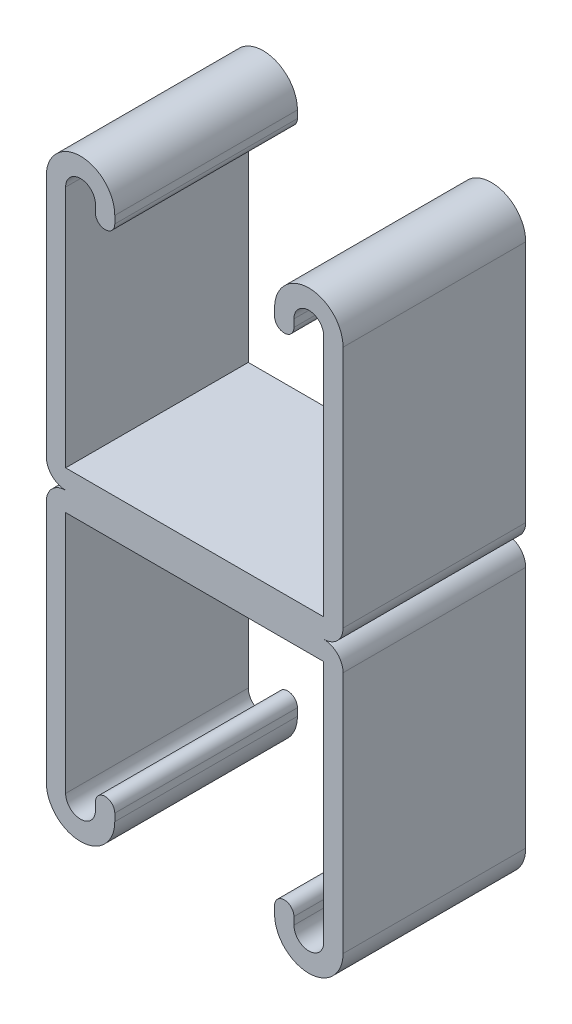
ISO-10303-21;
HEADER;
FILE_DESCRIPTION(('STEP AP214'),'2;1');
FILE_NAME('part.step','',(''),(''),'','','');
FILE_SCHEMA(('AUTOMOTIVE_DESIGN { 1 0 10303 214 1 1 1 1 }'));
ENDSEC;
DATA;
#1=APPLICATION_CONTEXT('core data for automotive mechanical design processes');
#2=APPLICATION_PROTOCOL_DEFINITION('international standard','automotive_design',2000,#1);
#3=PRODUCT_CONTEXT('',#1,'mechanical');
#4=PRODUCT('Part','Part','',(#3));
#5=PRODUCT_RELATED_PRODUCT_CATEGORY('part','',(#4));
#6=PRODUCT_DEFINITION_FORMATION('','',#4);
#7=PRODUCT_DEFINITION_CONTEXT('part definition',#1,'design');
#8=PRODUCT_DEFINITION('design','',#6,#7);
#9=PRODUCT_DEFINITION_SHAPE('','',#8);
#10=(LENGTH_UNIT() NAMED_UNIT(*) SI_UNIT(.MILLI.,.METRE.));
#11=(NAMED_UNIT(*) PLANE_ANGLE_UNIT() SI_UNIT($,.RADIAN.));
#12=(NAMED_UNIT(*) SI_UNIT($,.STERADIAN.) SOLID_ANGLE_UNIT());
#13=UNCERTAINTY_MEASURE_WITH_UNIT(LENGTH_MEASURE(1.E-05),#10,'distance_accuracy_value','');
#14=(GEOMETRIC_REPRESENTATION_CONTEXT(3) GLOBAL_UNCERTAINTY_ASSIGNED_CONTEXT((#13)) GLOBAL_UNIT_ASSIGNED_CONTEXT((#10,
#11,#12)) REPRESENTATION_CONTEXT('',''));
#15=CARTESIAN_POINT('',(0.,0.,0.));
#16=DIRECTION('',(0.,0.,1.));
#17=DIRECTION('',(1.,0.,0.));
#18=AXIS2_PLACEMENT_3D('',#15,#16,#17);
#19=CARTESIAN_POINT('',(-15.875,36.5125,12.7));
#20=DIRECTION('',(0.,0.,-1.));
#21=DIRECTION('',(-1.,0.,0.));
#22=AXIS2_PLACEMENT_3D('',#19,#20,#21);
#23=CYLINDRICAL_SURFACE('',#22,4.7625);
#24=CARTESIAN_POINT('',(-15.875,36.5125,-12.7));
#25=DIRECTION('',(0.,0.,1.));
#26=DIRECTION('',(-1.,0.,0.));
#27=AXIS2_PLACEMENT_3D('',#24,#25,#26);
#28=CIRCLE('',#27,4.7625);
#29=CARTESIAN_POINT('',(-11.1125,36.5125,-12.7));
#30=VERTEX_POINT('',#29);
#31=CARTESIAN_POINT('',(-20.6375,36.5125,-12.7));
#32=VERTEX_POINT('',#31);
#33=EDGE_CURVE('E189',#30,#32,#28,.T.);
#34=ORIENTED_EDGE('',*,*,#33,.T.);
#35=DIRECTION('',(0.,0.,-1.));
#36=VECTOR('',#35,1.);
#37=CARTESIAN_POINT('',(-20.6375,36.5125,12.7));
#38=LINE('',#37,#36);
#39=CARTESIAN_POINT('',(-20.6375,36.5125,12.7));
#40=VERTEX_POINT('',#39);
#41=EDGE_CURVE('E11',#40,#32,#38,.T.);
#42=ORIENTED_EDGE('',*,*,#41,.F.);
#43=CARTESIAN_POINT('',(-15.875,36.5125,12.7));
#44=DIRECTION('',(0.,0.,1.));
#45=DIRECTION('',(-1.,0.,0.));
#46=AXIS2_PLACEMENT_3D('',#43,#44,#45);
#47=CIRCLE('',#46,4.7625);
#48=CARTESIAN_POINT('',(-11.1125,36.5125,12.7));
#49=VERTEX_POINT('',#48);
#50=EDGE_CURVE('E222',#49,#40,#47,.T.);
#51=ORIENTED_EDGE('',*,*,#50,.F.);
#52=DIRECTION('',(0.,0.,-1.));
#53=VECTOR('',#52,1.);
#54=CARTESIAN_POINT('',(-11.1125,36.5125,12.7));
#55=LINE('',#54,#53);
#56=EDGE_CURVE('E185',#49,#30,#55,.T.);
#57=ORIENTED_EDGE('',*,*,#56,.T.);
#58=EDGE_LOOP('',(#34,#42,#51,#57));
#59=FACE_BOUND('',#58,.T.);
#60=ADVANCED_FACE('F32',(#59),#23,.T.);
#61=CARTESIAN_POINT('',(-20.6375,36.5125,12.7));
#62=DIRECTION('',(1.,0.,0.));
#63=DIRECTION('',(0.,1.,0.));
#64=AXIS2_PLACEMENT_3D('',#61,#62,#63);
#65=PLANE('',#64);
#66=DIRECTION('',(0.,-1.,0.));
#67=VECTOR('',#66,1.);
#68=CARTESIAN_POINT('',(-20.6375,36.5125,-12.7));
#69=LINE('',#68,#67);
#70=CARTESIAN_POINT('',(-20.6375,2.6924,-12.7));
#71=VERTEX_POINT('',#70);
#72=EDGE_CURVE('E192',#32,#71,#69,.T.);
#73=ORIENTED_EDGE('',*,*,#72,.T.);
#74=DIRECTION('',(0.,0.,-1.));
#75=VECTOR('',#74,1.);
#76=CARTESIAN_POINT('',(-20.6375,2.6924,12.7));
#77=LINE('',#76,#75);
#78=CARTESIAN_POINT('',(-20.6375,2.6924,12.7));
#79=VERTEX_POINT('',#78);
#80=EDGE_CURVE('E40',#79,#71,#77,.T.);
#81=ORIENTED_EDGE('',*,*,#80,.F.);
#82=DIRECTION('',(0.,-1.,0.));
#83=VECTOR('',#82,1.);
#84=CARTESIAN_POINT('',(-20.6375,36.5125,12.7));
#85=LINE('',#84,#83);
#86=EDGE_CURVE('E119',#40,#79,#85,.T.);
#87=ORIENTED_EDGE('',*,*,#86,.F.);
#88=ORIENTED_EDGE('',*,*,#41,.T.);
#89=EDGE_LOOP('',(#73,#81,#87,#88));
#90=FACE_BOUND('',#89,.T.);
#91=ADVANCED_FACE('F384',(#90),#65,.F.);
#92=CARTESIAN_POINT('',(-17.9451,2.6924,12.7));
#93=DIRECTION('',(0.,0.,-1.));
#94=DIRECTION('',(-1.,0.,0.));
#95=AXIS2_PLACEMENT_3D('',#92,#93,#94);
#96=CYLINDRICAL_SURFACE('',#95,2.6924);
#97=CARTESIAN_POINT('',(-17.9451,2.6924,-12.7));
#98=DIRECTION('',(0.,0.,1.));
#99=DIRECTION('',(-1.,0.,0.));
#100=AXIS2_PLACEMENT_3D('',#97,#98,#99);
#101=CIRCLE('',#100,2.6924);
#102=CARTESIAN_POINT('',(-17.9451,0.,-12.7));
#103=VERTEX_POINT('',#102);
#104=EDGE_CURVE('E195',#71,#103,#101,.T.);
#105=ORIENTED_EDGE('',*,*,#104,.T.);
#106=DIRECTION('',(0.,0.,-1.));
#107=VECTOR('',#106,1.);
#108=CARTESIAN_POINT('',(-17.9451,0.,12.7));
#109=LINE('',#108,#107);
#110=CARTESIAN_POINT('',(-17.9451,0.,12.7));
#111=VERTEX_POINT('',#110);
#112=EDGE_CURVE('E259',#111,#103,#109,.T.);
#113=ORIENTED_EDGE('',*,*,#112,.F.);
#114=CARTESIAN_POINT('',(-17.9451,2.6924,12.7));
#115=DIRECTION('',(0.,0.,1.));
#116=DIRECTION('',(-1.,0.,0.));
#117=AXIS2_PLACEMENT_3D('',#114,#115,#116);
#118=CIRCLE('',#117,2.6924);
#119=EDGE_CURVE('E267',#79,#111,#118,.T.);
#120=ORIENTED_EDGE('',*,*,#119,.F.);
#121=ORIENTED_EDGE('',*,*,#80,.T.);
#122=EDGE_LOOP('',(#105,#113,#120,#121));
#123=FACE_BOUND('',#122,.T.);
#124=ADVANCED_FACE('F265',(#123),#96,.T.);
#125=CARTESIAN_POINT('',(17.9451,2.6924,12.7));
#126=DIRECTION('',(0.,0.,-1.));
#127=DIRECTION('',(-1.,0.,0.));
#128=AXIS2_PLACEMENT_3D('',#125,#126,#127);
#129=CYLINDRICAL_SURFACE('',#128,2.6924);
#130=CARTESIAN_POINT('',(17.9451,2.6924,-12.7));
#131=DIRECTION('',(0.,0.,1.));
#132=DIRECTION('',(1.,0.,0.));
#133=AXIS2_PLACEMENT_3D('',#130,#131,#132);
#134=CIRCLE('',#133,2.6924);
#135=CARTESIAN_POINT('',(17.9451,0.,-12.7));
#136=VERTEX_POINT('',#135);
#137=CARTESIAN_POINT('',(20.6375,2.6924,-12.7));
#138=VERTEX_POINT('',#137);
#139=EDGE_CURVE('E197',#136,#138,#134,.T.);
#140=ORIENTED_EDGE('',*,*,#139,.T.);
#141=DIRECTION('',(0.,0.,-1.));
#142=VECTOR('',#141,1.);
#143=CARTESIAN_POINT('',(20.6375,2.6924,12.7));
#144=LINE('',#143,#142);
#145=CARTESIAN_POINT('',(20.6375,2.6924,12.7));
#146=VERTEX_POINT('',#145);
#147=EDGE_CURVE('E253',#146,#138,#144,.T.);
#148=ORIENTED_EDGE('',*,*,#147,.F.);
#149=CARTESIAN_POINT('',(17.9451,2.6924,12.7));
#150=DIRECTION('',(0.,0.,1.));
#151=DIRECTION('',(1.,0.,0.));
#152=AXIS2_PLACEMENT_3D('',#149,#150,#151);
#153=CIRCLE('',#152,2.6924);
#154=CARTESIAN_POINT('',(17.9451,0.,12.7));
#155=VERTEX_POINT('',#154);
#156=EDGE_CURVE('E341',#155,#146,#153,.T.);
#157=ORIENTED_EDGE('',*,*,#156,.F.);
#158=DIRECTION('',(0.,0.,-1.));
#159=VECTOR('',#158,1.);
#160=CARTESIAN_POINT('',(17.9451,0.,12.7));
#161=LINE('',#160,#159);
#162=EDGE_CURVE('E256',#155,#136,#161,.T.);
#163=ORIENTED_EDGE('',*,*,#162,.T.);
#164=EDGE_LOOP('',(#140,#148,#157,#163));
#165=FACE_BOUND('',#164,.T.);
#166=ADVANCED_FACE('F391',(#165),#129,.T.);
#167=CARTESIAN_POINT('',(20.6375,2.6924,12.7));
#168=DIRECTION('',(-1.,0.,0.));
#169=DIRECTION('',(0.,0.,1.));
#170=AXIS2_PLACEMENT_3D('',#167,#168,#169);
#171=PLANE('',#170);
#172=DIRECTION('',(0.,1.,0.));
#173=VECTOR('',#172,1.);
#174=CARTESIAN_POINT('',(20.6375,2.6924,-12.7));
#175=LINE('',#174,#173);
#176=CARTESIAN_POINT('',(20.6375,36.5125,-12.7));
#177=VERTEX_POINT('',#176);
#178=EDGE_CURVE('E199',#138,#177,#175,.T.);
#179=ORIENTED_EDGE('',*,*,#178,.T.);
#180=DIRECTION('',(0.,0.,-1.));
#181=VECTOR('',#180,1.);
#182=CARTESIAN_POINT('',(20.6375,36.5125,12.7));
#183=LINE('',#182,#181);
#184=CARTESIAN_POINT('',(20.6375,36.5125,12.7));
#185=VERTEX_POINT('',#184);
#186=EDGE_CURVE('E250',#185,#177,#183,.T.);
#187=ORIENTED_EDGE('',*,*,#186,.F.);
#188=DIRECTION('',(0.,1.,0.));
#189=VECTOR('',#188,1.);
#190=CARTESIAN_POINT('',(20.6375,2.6924,12.7));
#191=LINE('',#190,#189);
#192=EDGE_CURVE('E343',#146,#185,#191,.T.);
#193=ORIENTED_EDGE('',*,*,#192,.F.);
#194=ORIENTED_EDGE('',*,*,#147,.T.);
#195=EDGE_LOOP('',(#179,#187,#193,#194));
#196=FACE_BOUND('',#195,.T.);
#197=ADVANCED_FACE('F396',(#196),#171,.F.);
#198=CARTESIAN_POINT('',(15.875,36.5125,12.7));
#199=DIRECTION('',(0.,0.,-1.));
#200=DIRECTION('',(-1.,0.,0.));
#201=AXIS2_PLACEMENT_3D('',#198,#199,#200);
#202=CYLINDRICAL_SURFACE('',#201,4.7625);
#203=CARTESIAN_POINT('',(15.875,36.5125,-12.7));
#204=DIRECTION('',(0.,0.,1.));
#205=DIRECTION('',(1.,0.,0.));
#206=AXIS2_PLACEMENT_3D('',#203,#204,#205);
#207=CIRCLE('',#206,4.7625);
#208=CARTESIAN_POINT('',(11.1125,36.5125,-12.7));
#209=VERTEX_POINT('',#208);
#210=EDGE_CURVE('E201',#177,#209,#207,.T.);
#211=ORIENTED_EDGE('',*,*,#210,.T.);
#212=DIRECTION('',(0.,0.,-1.));
#213=VECTOR('',#212,1.);
#214=CARTESIAN_POINT('',(11.1125,36.5125,12.7));
#215=LINE('',#214,#213);
#216=CARTESIAN_POINT('',(11.1125,36.5125,12.7));
#217=VERTEX_POINT('',#216);
#218=EDGE_CURVE('E247',#217,#209,#215,.T.);
#219=ORIENTED_EDGE('',*,*,#218,.F.);
#220=CARTESIAN_POINT('',(15.875,36.5125,12.7));
#221=DIRECTION('',(0.,0.,1.));
#222=DIRECTION('',(1.,0.,0.));
#223=AXIS2_PLACEMENT_3D('',#220,#221,#222);
#224=CIRCLE('',#223,4.7625);
#225=EDGE_CURVE('E345',#185,#217,#224,.T.);
#226=ORIENTED_EDGE('',*,*,#225,.F.);
#227=ORIENTED_EDGE('',*,*,#186,.T.);
#228=EDGE_LOOP('',(#211,#219,#226,#227));
#229=FACE_BOUND('',#228,.T.);
#230=ADVANCED_FACE('F400',(#229),#202,.T.);
#231=CARTESIAN_POINT('',(11.1125,36.5125,12.7));
#232=DIRECTION('',(1.,0.,0.));
#233=DIRECTION('',(0.,1.,0.));
#234=AXIS2_PLACEMENT_3D('',#231,#232,#233);
#235=PLANE('',#234);
#236=DIRECTION('',(0.,-1.,0.));
#237=VECTOR('',#236,1.);
#238=CARTESIAN_POINT('',(11.1125,36.5125,-12.7));
#239=LINE('',#238,#237);
#240=CARTESIAN_POINT('',(11.1125,35.47745,-12.7));
#241=VERTEX_POINT('',#240);
#242=EDGE_CURVE('E203',#209,#241,#239,.T.);
#243=ORIENTED_EDGE('',*,*,#242,.T.);
#244=DIRECTION('',(0.,0.,-1.));
#245=VECTOR('',#244,1.);
#246=CARTESIAN_POINT('',(11.1125,35.47745,12.7));
#247=LINE('',#246,#245);
#248=CARTESIAN_POINT('',(11.1125,35.47745,12.7));
#249=VERTEX_POINT('',#248);
#250=EDGE_CURVE('E244',#249,#241,#247,.T.);
#251=ORIENTED_EDGE('',*,*,#250,.F.);
#252=DIRECTION('',(0.,-1.,0.));
#253=VECTOR('',#252,1.);
#254=CARTESIAN_POINT('',(11.1125,36.5125,12.7));
#255=LINE('',#254,#253);
#256=EDGE_CURVE('E347',#217,#249,#255,.T.);
#257=ORIENTED_EDGE('',*,*,#256,.F.);
#258=ORIENTED_EDGE('',*,*,#218,.T.);
#259=EDGE_LOOP('',(#243,#251,#257,#258));
#260=FACE_BOUND('',#259,.T.);
#261=ADVANCED_FACE('F404',(#260),#235,.F.);
#262=CARTESIAN_POINT('',(12.4587,35.47745,12.7));
#263=DIRECTION('',(0.,0.,-1.));
#264=DIRECTION('',(-1.,0.,0.));
#265=AXIS2_PLACEMENT_3D('',#262,#263,#264);
#266=CYLINDRICAL_SURFACE('',#265,1.3462);
#267=CARTESIAN_POINT('',(12.4587,35.47745,-12.7));
#268=DIRECTION('',(0.,0.,1.));
#269=DIRECTION('',(1.,0.,0.));
#270=AXIS2_PLACEMENT_3D('',#267,#268,#269);
#271=CIRCLE('',#270,1.3462);
#272=CARTESIAN_POINT('',(13.8049,35.47745,-12.7));
#273=VERTEX_POINT('',#272);
#274=EDGE_CURVE('E205',#241,#273,#271,.T.);
#275=ORIENTED_EDGE('',*,*,#274,.T.);
#276=DIRECTION('',(0.,0.,-1.));
#277=VECTOR('',#276,1.);
#278=CARTESIAN_POINT('',(13.8049,35.47745,12.7));
#279=LINE('',#278,#277);
#280=CARTESIAN_POINT('',(13.8049,35.47745,12.7));
#281=VERTEX_POINT('',#280);
#282=EDGE_CURVE('E241',#281,#273,#279,.T.);
#283=ORIENTED_EDGE('',*,*,#282,.F.);
#284=CARTESIAN_POINT('',(12.4587,35.47745,12.7));
#285=DIRECTION('',(0.,0.,1.));
#286=DIRECTION('',(1.,0.,0.));
#287=AXIS2_PLACEMENT_3D('',#284,#285,#286);
#288=CIRCLE('',#287,1.3462);
#289=EDGE_CURVE('E349',#249,#281,#288,.T.);
#290=ORIENTED_EDGE('',*,*,#289,.F.);
#291=ORIENTED_EDGE('',*,*,#250,.T.);
#292=EDGE_LOOP('',(#275,#283,#290,#291));
#293=FACE_BOUND('',#292,.T.);
#294=ADVANCED_FACE('F408',(#293),#266,.T.);
#295=CARTESIAN_POINT('',(13.8049,36.5125,12.7));
#296=DIRECTION('',(-1.,0.,0.));
#297=DIRECTION('',(0.,0.,1.));
#298=AXIS2_PLACEMENT_3D('',#295,#296,#297);
#299=PLANE('',#298);
#300=DIRECTION('',(0.,1.,0.));
#301=VECTOR('',#300,1.);
#302=CARTESIAN_POINT('',(13.8049,36.5125,-12.7));
#303=LINE('',#302,#301);
#304=CARTESIAN_POINT('',(13.8049,36.5125,-12.7));
#305=VERTEX_POINT('',#304);
#306=EDGE_CURVE('E207',#273,#305,#303,.T.);
#307=ORIENTED_EDGE('',*,*,#306,.T.);
#308=DIRECTION('',(0.,0.,-1.));
#309=VECTOR('',#308,1.);
#310=CARTESIAN_POINT('',(13.8049,36.5125,12.7));
#311=LINE('',#310,#309);
#312=CARTESIAN_POINT('',(13.8049,36.5125,12.7));
#313=VERTEX_POINT('',#312);
#314=EDGE_CURVE('E238',#313,#305,#311,.T.);
#315=ORIENTED_EDGE('',*,*,#314,.F.);
#316=DIRECTION('',(0.,1.,0.));
#317=VECTOR('',#316,1.);
#318=CARTESIAN_POINT('',(13.8049,36.5125,12.7));
#319=LINE('',#318,#317);
#320=EDGE_CURVE('E351',#281,#313,#319,.T.);
#321=ORIENTED_EDGE('',*,*,#320,.F.);
#322=ORIENTED_EDGE('',*,*,#282,.T.);
#323=EDGE_LOOP('',(#307,#315,#321,#322));
#324=FACE_BOUND('',#323,.T.);
#325=ADVANCED_FACE('F412',(#324),#299,.F.);
#326=CARTESIAN_POINT('',(15.875,36.5125,12.7));
#327=DIRECTION('',(0.,0.,-1.));
#328=DIRECTION('',(-1.,0.,0.));
#329=AXIS2_PLACEMENT_3D('',#326,#327,#328);
#330=CYLINDRICAL_SURFACE('',#329,2.0701);
#331=CARTESIAN_POINT('',(15.875,36.5125,-12.7));
#332=DIRECTION('',(0.,0.,-1.));
#333=DIRECTION('',(1.,0.,0.));
#334=AXIS2_PLACEMENT_3D('',#331,#332,#333);
#335=CIRCLE('',#334,2.0701);
#336=CARTESIAN_POINT('',(17.9451,36.5125,-12.7));
#337=VERTEX_POINT('',#336);
#338=EDGE_CURVE('E209',#305,#337,#335,.T.);
#339=ORIENTED_EDGE('',*,*,#338,.T.);
#340=DIRECTION('',(0.,0.,-1.));
#341=VECTOR('',#340,1.);
#342=CARTESIAN_POINT('',(17.9451,36.5125,12.7));
#343=LINE('',#342,#341);
#344=CARTESIAN_POINT('',(17.9451,36.5125,12.7));
#345=VERTEX_POINT('',#344);
#346=EDGE_CURVE('E235',#345,#337,#343,.T.);
#347=ORIENTED_EDGE('',*,*,#346,.F.);
#348=CARTESIAN_POINT('',(15.875,36.5125,12.7));
#349=DIRECTION('',(0.,0.,-1.));
#350=DIRECTION('',(1.,0.,0.));
#351=AXIS2_PLACEMENT_3D('',#348,#349,#350);
#352=CIRCLE('',#351,2.0701);
#353=EDGE_CURVE('E353',#313,#345,#352,.T.);
#354=ORIENTED_EDGE('',*,*,#353,.F.);
#355=ORIENTED_EDGE('',*,*,#314,.T.);
#356=EDGE_LOOP('',(#339,#347,#354,#355));
#357=FACE_BOUND('',#356,.T.);
#358=ADVANCED_FACE('F416',(#357),#330,.F.);
#359=CARTESIAN_POINT('',(17.9451,2.6924,12.7));
#360=DIRECTION('',(1.,0.,0.));
#361=DIRECTION('',(0.,1.,0.));
#362=AXIS2_PLACEMENT_3D('',#359,#360,#361);
#363=PLANE('',#362);
#364=DIRECTION('',(0.,-1.,0.));
#365=VECTOR('',#364,1.);
#366=CARTESIAN_POINT('',(17.9451,2.6924,-12.7));
#367=LINE('',#366,#365);
#368=CARTESIAN_POINT('',(17.9451,2.6924,-12.7));
#369=VERTEX_POINT('',#368);
#370=EDGE_CURVE('E211',#337,#369,#367,.T.);
#371=ORIENTED_EDGE('',*,*,#370,.T.);
#372=DIRECTION('',(0.,0.,-1.));
#373=VECTOR('',#372,1.);
#374=CARTESIAN_POINT('',(17.9451,2.6924,12.7));
#375=LINE('',#374,#373);
#376=CARTESIAN_POINT('',(17.9451,2.6924,12.7));
#377=VERTEX_POINT('',#376);
#378=EDGE_CURVE('E232',#377,#369,#375,.T.);
#379=ORIENTED_EDGE('',*,*,#378,.F.);
#380=DIRECTION('',(0.,-1.,0.));
#381=VECTOR('',#380,1.);
#382=CARTESIAN_POINT('',(17.9451,2.6924,12.7));
#383=LINE('',#382,#381);
#384=EDGE_CURVE('E355',#345,#377,#383,.T.);
#385=ORIENTED_EDGE('',*,*,#384,.F.);
#386=ORIENTED_EDGE('',*,*,#346,.T.);
#387=EDGE_LOOP('',(#371,#379,#385,#386));
#388=FACE_BOUND('',#387,.T.);
#389=ADVANCED_FACE('F420',(#388),#363,.F.);
#390=CARTESIAN_POINT('',(-17.9451,2.6924,12.7));
#391=DIRECTION('',(0.,-1.,0.));
#392=DIRECTION('',(1.,0.,0.));
#393=AXIS2_PLACEMENT_3D('',#390,#391,#392);
#394=PLANE('',#393);
#395=DIRECTION('',(-1.,0.,0.));
#396=VECTOR('',#395,1.);
#397=CARTESIAN_POINT('',(-17.9451,2.6924,-12.7));
#398=LINE('',#397,#396);
#399=CARTESIAN_POINT('',(-17.9451,2.6924,-12.7));
#400=VERTEX_POINT('',#399);
#401=EDGE_CURVE('E213',#369,#400,#398,.T.);
#402=ORIENTED_EDGE('',*,*,#401,.T.);
#403=DIRECTION('',(0.,0.,-1.));
#404=VECTOR('',#403,1.);
#405=CARTESIAN_POINT('',(-17.9451,2.6924,12.7));
#406=LINE('',#405,#404);
#407=CARTESIAN_POINT('',(-17.9451,2.6924,12.7));
#408=VERTEX_POINT('',#407);
#409=EDGE_CURVE('E229',#408,#400,#406,.T.);
#410=ORIENTED_EDGE('',*,*,#409,.F.);
#411=DIRECTION('',(-1.,0.,0.));
#412=VECTOR('',#411,1.);
#413=CARTESIAN_POINT('',(-17.9451,2.6924,12.7));
#414=LINE('',#413,#412);
#415=EDGE_CURVE('E357',#377,#408,#414,.T.);
#416=ORIENTED_EDGE('',*,*,#415,.F.);
#417=ORIENTED_EDGE('',*,*,#378,.T.);
#418=EDGE_LOOP('',(#402,#410,#416,#417));
#419=FACE_BOUND('',#418,.T.);
#420=ADVANCED_FACE('F424',(#419),#394,.F.);
#421=CARTESIAN_POINT('',(-17.9451,36.5125,12.7));
#422=DIRECTION('',(-1.,0.,0.));
#423=DIRECTION('',(0.,-1.,0.));
#424=AXIS2_PLACEMENT_3D('',#421,#422,#423);
#425=PLANE('',#424);
#426=DIRECTION('',(0.,1.,0.));
#427=VECTOR('',#426,1.);
#428=CARTESIAN_POINT('',(-17.9451,36.5125,-12.7));
#429=LINE('',#428,#427);
#430=CARTESIAN_POINT('',(-17.9451,36.5125,-12.7));
#431=VERTEX_POINT('',#430);
#432=EDGE_CURVE('E215',#400,#431,#429,.T.);
#433=ORIENTED_EDGE('',*,*,#432,.T.);
#434=DIRECTION('',(0.,0.,-1.));
#435=VECTOR('',#434,1.);
#436=CARTESIAN_POINT('',(-17.9451,36.5125,12.7));
#437=LINE('',#436,#435);
#438=CARTESIAN_POINT('',(-17.9451,36.5125,12.7));
#439=VERTEX_POINT('',#438);
#440=EDGE_CURVE('E226',#439,#431,#437,.T.);
#441=ORIENTED_EDGE('',*,*,#440,.F.);
#442=DIRECTION('',(0.,1.,0.));
#443=VECTOR('',#442,1.);
#444=CARTESIAN_POINT('',(-17.9451,36.5125,12.7));
#445=LINE('',#444,#443);
#446=EDGE_CURVE('E359',#408,#439,#445,.T.);
#447=ORIENTED_EDGE('',*,*,#446,.F.);
#448=ORIENTED_EDGE('',*,*,#409,.T.);
#449=EDGE_LOOP('',(#433,#441,#447,#448));
#450=FACE_BOUND('',#449,.T.);
#451=ADVANCED_FACE('F365',(#450),#425,.F.);
#452=CARTESIAN_POINT('',(-15.875,36.5125,12.7));
#453=DIRECTION('',(0.,0.,-1.));
#454=DIRECTION('',(-1.,0.,0.));
#455=AXIS2_PLACEMENT_3D('',#452,#453,#454);
#456=CYLINDRICAL_SURFACE('',#455,2.0701);
#457=CARTESIAN_POINT('',(-15.875,36.5125,-12.7));
#458=DIRECTION('',(0.,0.,-1.));
#459=DIRECTION('',(-1.,0.,0.));
#460=AXIS2_PLACEMENT_3D('',#457,#458,#459);
#461=CIRCLE('',#460,2.0701);
#462=CARTESIAN_POINT('',(-13.8049,36.5125,-12.7));
#463=VERTEX_POINT('',#462);
#464=EDGE_CURVE('E217',#431,#463,#461,.T.);
#465=ORIENTED_EDGE('',*,*,#464,.T.);
#466=DIRECTION('',(0.,0.,-1.));
#467=VECTOR('',#466,1.);
#468=CARTESIAN_POINT('',(-13.8049,36.5125,12.7));
#469=LINE('',#468,#467);
#470=CARTESIAN_POINT('',(-13.8049,36.5125,12.7));
#471=VERTEX_POINT('',#470);
#472=EDGE_CURVE('E180',#471,#463,#469,.T.);
#473=ORIENTED_EDGE('',*,*,#472,.F.);
#474=CARTESIAN_POINT('',(-15.875,36.5125,12.7));
#475=DIRECTION('',(0.,0.,-1.));
#476=DIRECTION('',(-1.,0.,0.));
#477=AXIS2_PLACEMENT_3D('',#474,#475,#476);
#478=CIRCLE('',#477,2.0701);
#479=EDGE_CURVE('E171',#439,#471,#478,.T.);
#480=ORIENTED_EDGE('',*,*,#479,.F.);
#481=ORIENTED_EDGE('',*,*,#440,.T.);
#482=EDGE_LOOP('',(#465,#473,#480,#481));
#483=FACE_BOUND('',#482,.T.);
#484=ADVANCED_FACE('F369',(#483),#456,.F.);
#485=CARTESIAN_POINT('',(-13.8049,36.5125,12.7));
#486=DIRECTION('',(1.,0.,0.));
#487=DIRECTION('',(0.,1.,0.));
#488=AXIS2_PLACEMENT_3D('',#485,#486,#487);
#489=PLANE('',#488);
#490=DIRECTION('',(0.,-1.,0.));
#491=VECTOR('',#490,1.);
#492=CARTESIAN_POINT('',(-13.8049,36.5125,-12.7));
#493=LINE('',#492,#491);
#494=CARTESIAN_POINT('',(-13.8049,35.47745,-12.7));
#495=VERTEX_POINT('',#494);
#496=EDGE_CURVE('E179',#463,#495,#493,.T.);
#497=ORIENTED_EDGE('',*,*,#496,.T.);
#498=DIRECTION('',(0.,0.,-1.));
#499=VECTOR('',#498,1.);
#500=CARTESIAN_POINT('',(-13.8049,35.47745,12.7));
#501=LINE('',#500,#499);
#502=CARTESIAN_POINT('',(-13.8049,35.47745,12.7));
#503=VERTEX_POINT('',#502);
#504=EDGE_CURVE('E176',#503,#495,#501,.T.);
#505=ORIENTED_EDGE('',*,*,#504,.F.);
#506=DIRECTION('',(0.,-1.,0.));
#507=VECTOR('',#506,1.);
#508=CARTESIAN_POINT('',(-13.8049,36.5125,12.7));
#509=LINE('',#508,#507);
#510=EDGE_CURVE('E165',#471,#503,#509,.T.);
#511=ORIENTED_EDGE('',*,*,#510,.F.);
#512=ORIENTED_EDGE('',*,*,#472,.T.);
#513=EDGE_LOOP('',(#497,#505,#511,#512));
#514=FACE_BOUND('',#513,.T.);
#515=ADVANCED_FACE('F177',(#514),#489,.F.);
#516=CARTESIAN_POINT('',(-12.4587,35.47745,12.7));
#517=DIRECTION('',(0.,0.,-1.));
#518=DIRECTION('',(-1.,0.,0.));
#519=AXIS2_PLACEMENT_3D('',#516,#517,#518);
#520=CYLINDRICAL_SURFACE('',#519,1.3462);
#521=CARTESIAN_POINT('',(-12.4587,35.47745,-12.7));
#522=DIRECTION('',(0.,0.,1.));
#523=DIRECTION('',(-1.,0.,0.));
#524=AXIS2_PLACEMENT_3D('',#521,#522,#523);
#525=CIRCLE('',#524,1.3462);
#526=CARTESIAN_POINT('',(-11.1125,35.47745,-12.7));
#527=VERTEX_POINT('',#526);
#528=EDGE_CURVE('E105',#495,#527,#525,.T.);
#529=ORIENTED_EDGE('',*,*,#528,.T.);
#530=DIRECTION('',(0.,0.,-1.));
#531=VECTOR('',#530,1.);
#532=CARTESIAN_POINT('',(-11.1125,35.47745,12.7));
#533=LINE('',#532,#531);
#534=CARTESIAN_POINT('',(-11.1125,35.47745,12.7));
#535=VERTEX_POINT('',#534);
#536=EDGE_CURVE('E181',#535,#527,#533,.T.);
#537=ORIENTED_EDGE('',*,*,#536,.F.);
#538=CARTESIAN_POINT('',(-12.4587,35.47745,12.7));
#539=DIRECTION('',(0.,0.,1.));
#540=DIRECTION('',(-1.,0.,0.));
#541=AXIS2_PLACEMENT_3D('',#538,#539,#540);
#542=CIRCLE('',#541,1.3462);
#543=EDGE_CURVE('E169',#503,#535,#542,.T.);
#544=ORIENTED_EDGE('',*,*,#543,.F.);
#545=ORIENTED_EDGE('',*,*,#504,.T.);
#546=EDGE_LOOP('',(#529,#537,#544,#545));
#547=FACE_BOUND('',#546,.T.);
#548=ADVANCED_FACE('F183',(#547),#520,.T.);
#549=CARTESIAN_POINT('',(-11.1125,36.5125,12.7));
#550=DIRECTION('',(-1.,0.,0.));
#551=DIRECTION('',(0.,0.,1.));
#552=AXIS2_PLACEMENT_3D('',#549,#550,#551);
#553=PLANE('',#552);
#554=DIRECTION('',(0.,1.,0.));
#555=VECTOR('',#554,1.);
#556=CARTESIAN_POINT('',(-11.1125,36.5125,-12.7));
#557=LINE('',#556,#555);
#558=EDGE_CURVE('E111',#527,#30,#557,.T.);
#559=ORIENTED_EDGE('',*,*,#558,.T.);
#560=ORIENTED_EDGE('',*,*,#56,.F.);
#561=DIRECTION('',(0.,1.,0.));
#562=VECTOR('',#561,1.);
#563=CARTESIAN_POINT('',(-11.1125,36.5125,12.7));
#564=LINE('',#563,#562);
#565=EDGE_CURVE('E48',#535,#49,#564,.T.);
#566=ORIENTED_EDGE('',*,*,#565,.F.);
#567=ORIENTED_EDGE('',*,*,#536,.T.);
#568=EDGE_LOOP('',(#559,#560,#566,#567));
#569=FACE_BOUND('',#568,.T.);
#570=ADVANCED_FACE('F373',(#569),#553,.F.);
#571=CARTESIAN_POINT('',(-15.875,36.5125,12.7));
#572=DIRECTION('',(0.,0.,-1.));
#573=DIRECTION('',(-1.,0.,0.));
#574=AXIS2_PLACEMENT_3D('',#571,#572,#573);
#575=PLANE('',#574);
#576=ORIENTED_EDGE('',*,*,#50,.T.);
#577=ORIENTED_EDGE('',*,*,#86,.T.);
#578=ORIENTED_EDGE('',*,*,#119,.T.);
#579=CARTESIAN_POINT('',(-17.9451,-2.6924,12.7));
#580=DIRECTION('',(0.,0.,-1.));
#581=DIRECTION('',(-1.,0.,0.));
#582=AXIS2_PLACEMENT_3D('',#579,#580,#581);
#583=CIRCLE('',#582,2.6924);
#584=CARTESIAN_POINT('',(-20.6375,-2.6924,12.7));
#585=VERTEX_POINT('',#584);
#586=EDGE_CURVE('E782',#585,#111,#583,.T.);
#587=ORIENTED_EDGE('',*,*,#586,.F.);
#588=DIRECTION('',(0.,1.,0.));
#589=VECTOR('',#588,1.);
#590=CARTESIAN_POINT('',(-20.6375,-36.5125,12.7));
#591=LINE('',#590,#589);
#592=CARTESIAN_POINT('',(-20.6375,-36.5125,12.7));
#593=VERTEX_POINT('',#592);
#594=EDGE_CURVE('E294',#593,#585,#591,.T.);
#595=ORIENTED_EDGE('',*,*,#594,.F.);
#596=CARTESIAN_POINT('',(-15.875,-36.5125,12.7));
#597=DIRECTION('',(0.,0.,-1.));
#598=DIRECTION('',(-1.,0.,0.));
#599=AXIS2_PLACEMENT_3D('',#596,#597,#598);
#600=CIRCLE('',#599,4.7625);
#601=CARTESIAN_POINT('',(-11.1125,-36.5125,12.7));
#602=VERTEX_POINT('',#601);
#603=EDGE_CURVE('E283',#602,#593,#600,.T.);
#604=ORIENTED_EDGE('',*,*,#603,.F.);
#605=DIRECTION('',(0.,-1.,0.));
#606=VECTOR('',#605,1.);
#607=CARTESIAN_POINT('',(-11.1125,-36.5125,12.7));
#608=LINE('',#607,#606);
#609=CARTESIAN_POINT('',(-11.1125,-35.47745,12.7));
#610=VERTEX_POINT('',#609);
#611=EDGE_CURVE('E731',#610,#602,#608,.T.);
#612=ORIENTED_EDGE('',*,*,#611,.F.);
#613=CARTESIAN_POINT('',(-12.4587,-35.47745,12.7));
#614=DIRECTION('',(0.,0.,-1.));
#615=DIRECTION('',(-1.,0.,0.));
#616=AXIS2_PLACEMENT_3D('',#613,#614,#615);
#617=CIRCLE('',#616,1.3462);
#618=CARTESIAN_POINT('',(-13.8049,-35.47745,12.7));
#619=VERTEX_POINT('',#618);
#620=EDGE_CURVE('E740',#619,#610,#617,.T.);
#621=ORIENTED_EDGE('',*,*,#620,.F.);
#622=DIRECTION('',(0.,1.,0.));
#623=VECTOR('',#622,1.);
#624=CARTESIAN_POINT('',(-13.8049,-36.5125,12.7));
#625=LINE('',#624,#623);
#626=CARTESIAN_POINT('',(-13.8049,-36.5125,12.7));
#627=VERTEX_POINT('',#626);
#628=EDGE_CURVE('E744',#627,#619,#625,.T.);
#629=ORIENTED_EDGE('',*,*,#628,.F.);
#630=CARTESIAN_POINT('',(-15.875,-36.5125,12.7));
#631=DIRECTION('',(0.,0.,1.));
#632=DIRECTION('',(-1.,0.,0.));
#633=AXIS2_PLACEMENT_3D('',#630,#631,#632);
#634=CIRCLE('',#633,2.0701);
#635=CARTESIAN_POINT('',(-17.9451,-36.5125,12.7));
#636=VERTEX_POINT('',#635);
#637=EDGE_CURVE('E746',#636,#627,#634,.T.);
#638=ORIENTED_EDGE('',*,*,#637,.F.);
#639=DIRECTION('',(0.,-1.,0.));
#640=VECTOR('',#639,1.);
#641=CARTESIAN_POINT('',(-17.9451,-36.5125,12.7));
#642=LINE('',#641,#640);
#643=CARTESIAN_POINT('',(-17.9451,-2.6924,12.7));
#644=VERTEX_POINT('',#643);
#645=EDGE_CURVE('E752',#644,#636,#642,.T.);
#646=ORIENTED_EDGE('',*,*,#645,.F.);
#647=DIRECTION('',(-1.,0.,0.));
#648=VECTOR('',#647,1.);
#649=CARTESIAN_POINT('',(-17.9451,-2.6924,12.7));
#650=LINE('',#649,#648);
#651=CARTESIAN_POINT('',(17.9451,-2.6924,12.7));
#652=VERTEX_POINT('',#651);
#653=EDGE_CURVE('E755',#652,#644,#650,.T.);
#654=ORIENTED_EDGE('',*,*,#653,.F.);
#655=DIRECTION('',(0.,1.,0.));
#656=VECTOR('',#655,1.);
#657=CARTESIAN_POINT('',(17.9451,-2.6924,12.7));
#658=LINE('',#657,#656);
#659=CARTESIAN_POINT('',(17.9451,-36.5125,12.7));
#660=VERTEX_POINT('',#659);
#661=EDGE_CURVE('E758',#660,#652,#658,.T.);
#662=ORIENTED_EDGE('',*,*,#661,.F.);
#663=CARTESIAN_POINT('',(15.875,-36.5125,12.7));
#664=DIRECTION('',(0.,0.,1.));
#665=DIRECTION('',(1.,0.,0.));
#666=AXIS2_PLACEMENT_3D('',#663,#664,#665);
#667=CIRCLE('',#666,2.0701);
#668=CARTESIAN_POINT('',(13.8049,-36.5125,12.7));
#669=VERTEX_POINT('',#668);
#670=EDGE_CURVE('E761',#669,#660,#667,.T.);
#671=ORIENTED_EDGE('',*,*,#670,.F.);
#672=DIRECTION('',(0.,-1.,0.));
#673=VECTOR('',#672,1.);
#674=CARTESIAN_POINT('',(13.8049,-36.5125,12.7));
#675=LINE('',#674,#673);
#676=CARTESIAN_POINT('',(13.8049,-35.47745,12.7));
#677=VERTEX_POINT('',#676);
#678=EDGE_CURVE('E764',#677,#669,#675,.T.);
#679=ORIENTED_EDGE('',*,*,#678,.F.);
#680=CARTESIAN_POINT('',(12.4587,-35.47745,12.7));
#681=DIRECTION('',(0.,0.,-1.));
#682=DIRECTION('',(1.,0.,0.));
#683=AXIS2_PLACEMENT_3D('',#680,#681,#682);
#684=CIRCLE('',#683,1.3462);
#685=CARTESIAN_POINT('',(11.1125,-35.47745,12.7));
#686=VERTEX_POINT('',#685);
#687=EDGE_CURVE('E767',#686,#677,#684,.T.);
#688=ORIENTED_EDGE('',*,*,#687,.F.);
#689=DIRECTION('',(0.,1.,0.));
#690=VECTOR('',#689,1.);
#691=CARTESIAN_POINT('',(11.1125,-36.5125,12.7));
#692=LINE('',#691,#690);
#693=CARTESIAN_POINT('',(11.1125,-36.5125,12.7));
#694=VERTEX_POINT('',#693);
#695=EDGE_CURVE('E770',#694,#686,#692,.T.);
#696=ORIENTED_EDGE('',*,*,#695,.F.);
#697=CARTESIAN_POINT('',(15.875,-36.5125,12.7));
#698=DIRECTION('',(0.,0.,-1.));
#699=DIRECTION('',(1.,0.,0.));
#700=AXIS2_PLACEMENT_3D('',#697,#698,#699);
#701=CIRCLE('',#700,4.7625);
#702=CARTESIAN_POINT('',(20.6375,-36.5125,12.7));
#703=VERTEX_POINT('',#702);
#704=EDGE_CURVE('E773',#703,#694,#701,.T.);
#705=ORIENTED_EDGE('',*,*,#704,.F.);
#706=DIRECTION('',(0.,-1.,0.));
#707=VECTOR('',#706,1.);
#708=CARTESIAN_POINT('',(20.6375,-2.6924,12.7));
#709=LINE('',#708,#707);
#710=CARTESIAN_POINT('',(20.6375,-2.6924,12.7));
#711=VERTEX_POINT('',#710);
#712=EDGE_CURVE('E776',#711,#703,#709,.T.);
#713=ORIENTED_EDGE('',*,*,#712,.F.);
#714=CARTESIAN_POINT('',(17.9451,-2.6924,12.7));
#715=DIRECTION('',(0.,0.,-1.));
#716=DIRECTION('',(1.,0.,0.));
#717=AXIS2_PLACEMENT_3D('',#714,#715,#716);
#718=CIRCLE('',#717,2.6924);
#719=EDGE_CURVE('E779',#155,#711,#718,.T.);
#720=ORIENTED_EDGE('',*,*,#719,.F.);
#721=ORIENTED_EDGE('',*,*,#156,.T.);
#722=ORIENTED_EDGE('',*,*,#192,.T.);
#723=ORIENTED_EDGE('',*,*,#225,.T.);
#724=ORIENTED_EDGE('',*,*,#256,.T.);
#725=ORIENTED_EDGE('',*,*,#289,.T.);
#726=ORIENTED_EDGE('',*,*,#320,.T.);
#727=ORIENTED_EDGE('',*,*,#353,.T.);
#728=ORIENTED_EDGE('',*,*,#384,.T.);
#729=ORIENTED_EDGE('',*,*,#415,.T.);
#730=ORIENTED_EDGE('',*,*,#446,.T.);
#731=ORIENTED_EDGE('',*,*,#479,.T.);
#732=ORIENTED_EDGE('',*,*,#510,.T.);
#733=ORIENTED_EDGE('',*,*,#543,.T.);
#734=ORIENTED_EDGE('',*,*,#565,.T.);
#735=EDGE_LOOP('',(#576,#577,#578,#587,#595,#604,#612,#621,#629,#638,#646,#654,#662,#671,#679,
#688,#696,#705,#713,#720,#721,#722,#723,#724,#725,#726,#727,#728,#729,#730,#731,#732,#733,#734));
#736=FACE_BOUND('',#735,.T.);
#737=ADVANCED_FACE('F167',(#736),#575,.F.);
#738=CARTESIAN_POINT('',(-15.875,36.5125,-12.7));
#739=DIRECTION('',(0.,0.,-1.));
#740=DIRECTION('',(-1.,0.,0.));
#741=AXIS2_PLACEMENT_3D('',#738,#739,#740);
#742=PLANE('',#741);
#743=ORIENTED_EDGE('',*,*,#33,.F.);
#744=ORIENTED_EDGE('',*,*,#558,.F.);
#745=ORIENTED_EDGE('',*,*,#528,.F.);
#746=ORIENTED_EDGE('',*,*,#496,.F.);
#747=ORIENTED_EDGE('',*,*,#464,.F.);
#748=ORIENTED_EDGE('',*,*,#432,.F.);
#749=ORIENTED_EDGE('',*,*,#401,.F.);
#750=ORIENTED_EDGE('',*,*,#370,.F.);
#751=ORIENTED_EDGE('',*,*,#338,.F.);
#752=ORIENTED_EDGE('',*,*,#306,.F.);
#753=ORIENTED_EDGE('',*,*,#274,.F.);
#754=ORIENTED_EDGE('',*,*,#242,.F.);
#755=ORIENTED_EDGE('',*,*,#210,.F.);
#756=ORIENTED_EDGE('',*,*,#178,.F.);
#757=ORIENTED_EDGE('',*,*,#139,.F.);
#758=CARTESIAN_POINT('',(17.9451,-2.6924,-12.7));
#759=DIRECTION('',(0.,0.,-1.));
#760=DIRECTION('',(1.,0.,0.));
#761=AXIS2_PLACEMENT_3D('',#758,#759,#760);
#762=CIRCLE('',#761,2.6924);
#763=CARTESIAN_POINT('',(20.6375,-2.6924,-12.7));
#764=VERTEX_POINT('',#763);
#765=EDGE_CURVE('E281',#136,#764,#762,.T.);
#766=ORIENTED_EDGE('',*,*,#765,.T.);
#767=DIRECTION('',(0.,-1.,0.));
#768=VECTOR('',#767,1.);
#769=CARTESIAN_POINT('',(20.6375,-2.6924,-12.7));
#770=LINE('',#769,#768);
#771=CARTESIAN_POINT('',(20.6375,-36.5125,-12.7));
#772=VERTEX_POINT('',#771);
#773=EDGE_CURVE('E286',#764,#772,#770,.T.);
#774=ORIENTED_EDGE('',*,*,#773,.T.);
#775=CARTESIAN_POINT('',(15.875,-36.5125,-12.7));
#776=DIRECTION('',(0.,0.,-1.));
#777=DIRECTION('',(1.,0.,0.));
#778=AXIS2_PLACEMENT_3D('',#775,#776,#777);
#779=CIRCLE('',#778,4.7625);
#780=CARTESIAN_POINT('',(11.1125,-36.5125,-12.7));
#781=VERTEX_POINT('',#780);
#782=EDGE_CURVE('E818',#772,#781,#779,.T.);
#783=ORIENTED_EDGE('',*,*,#782,.T.);
#784=DIRECTION('',(0.,1.,0.));
#785=VECTOR('',#784,1.);
#786=CARTESIAN_POINT('',(11.1125,-36.5125,-12.7));
#787=LINE('',#786,#785);
#788=CARTESIAN_POINT('',(11.1125,-35.47745,-12.7));
#789=VERTEX_POINT('',#788);
#790=EDGE_CURVE('E815',#781,#789,#787,.T.);
#791=ORIENTED_EDGE('',*,*,#790,.T.);
#792=CARTESIAN_POINT('',(12.4587,-35.47745,-12.7));
#793=DIRECTION('',(0.,0.,-1.));
#794=DIRECTION('',(1.,0.,0.));
#795=AXIS2_PLACEMENT_3D('',#792,#793,#794);
#796=CIRCLE('',#795,1.3462);
#797=CARTESIAN_POINT('',(13.8049,-35.47745,-12.7));
#798=VERTEX_POINT('',#797);
#799=EDGE_CURVE('E812',#789,#798,#796,.T.);
#800=ORIENTED_EDGE('',*,*,#799,.T.);
#801=DIRECTION('',(0.,-1.,0.));
#802=VECTOR('',#801,1.);
#803=CARTESIAN_POINT('',(13.8049,-36.5125,-12.7));
#804=LINE('',#803,#802);
#805=CARTESIAN_POINT('',(13.8049,-36.5125,-12.7));
#806=VERTEX_POINT('',#805);
#807=EDGE_CURVE('E809',#798,#806,#804,.T.);
#808=ORIENTED_EDGE('',*,*,#807,.T.);
#809=CARTESIAN_POINT('',(15.875,-36.5125,-12.7));
#810=DIRECTION('',(0.,0.,1.));
#811=DIRECTION('',(1.,0.,0.));
#812=AXIS2_PLACEMENT_3D('',#809,#810,#811);
#813=CIRCLE('',#812,2.0701);
#814=CARTESIAN_POINT('',(17.9451,-36.5125,-12.7));
#815=VERTEX_POINT('',#814);
#816=EDGE_CURVE('E806',#806,#815,#813,.T.);
#817=ORIENTED_EDGE('',*,*,#816,.T.);
#818=DIRECTION('',(0.,1.,0.));
#819=VECTOR('',#818,1.);
#820=CARTESIAN_POINT('',(17.9451,-2.6924,-12.7));
#821=LINE('',#820,#819);
#822=CARTESIAN_POINT('',(17.9451,-2.6924,-12.7));
#823=VERTEX_POINT('',#822);
#824=EDGE_CURVE('E803',#815,#823,#821,.T.);
#825=ORIENTED_EDGE('',*,*,#824,.T.);
#826=DIRECTION('',(-1.,0.,0.));
#827=VECTOR('',#826,1.);
#828=CARTESIAN_POINT('',(-17.9451,-2.6924,-12.7));
#829=LINE('',#828,#827);
#830=CARTESIAN_POINT('',(-17.9451,-2.6924,-12.7));
#831=VERTEX_POINT('',#830);
#832=EDGE_CURVE('E800',#823,#831,#829,.T.);
#833=ORIENTED_EDGE('',*,*,#832,.T.);
#834=DIRECTION('',(0.,-1.,0.));
#835=VECTOR('',#834,1.);
#836=CARTESIAN_POINT('',(-17.9451,-36.5125,-12.7));
#837=LINE('',#836,#835);
#838=CARTESIAN_POINT('',(-17.9451,-36.5125,-12.7));
#839=VERTEX_POINT('',#838);
#840=EDGE_CURVE('E797',#831,#839,#837,.T.);
#841=ORIENTED_EDGE('',*,*,#840,.T.);
#842=CARTESIAN_POINT('',(-15.875,-36.5125,-12.7));
#843=DIRECTION('',(0.,0.,1.));
#844=DIRECTION('',(-1.,0.,0.));
#845=AXIS2_PLACEMENT_3D('',#842,#843,#844);
#846=CIRCLE('',#845,2.0701);
#847=CARTESIAN_POINT('',(-13.8049,-36.5125,-12.7));
#848=VERTEX_POINT('',#847);
#849=EDGE_CURVE('E794',#839,#848,#846,.T.);
#850=ORIENTED_EDGE('',*,*,#849,.T.);
#851=DIRECTION('',(0.,1.,0.));
#852=VECTOR('',#851,1.);
#853=CARTESIAN_POINT('',(-13.8049,-36.5125,-12.7));
#854=LINE('',#853,#852);
#855=CARTESIAN_POINT('',(-13.8049,-35.47745,-12.7));
#856=VERTEX_POINT('',#855);
#857=EDGE_CURVE('E791',#848,#856,#854,.T.);
#858=ORIENTED_EDGE('',*,*,#857,.T.);
#859=CARTESIAN_POINT('',(-12.4587,-35.47745,-12.7));
#860=DIRECTION('',(0.,0.,-1.));
#861=DIRECTION('',(-1.,0.,0.));
#862=AXIS2_PLACEMENT_3D('',#859,#860,#861);
#863=CIRCLE('',#862,1.3462);
#864=CARTESIAN_POINT('',(-11.1125,-35.47745,-12.7));
#865=VERTEX_POINT('',#864);
#866=EDGE_CURVE('E789',#856,#865,#863,.T.);
#867=ORIENTED_EDGE('',*,*,#866,.T.);
#868=DIRECTION('',(0.,-1.,0.));
#869=VECTOR('',#868,1.);
#870=CARTESIAN_POINT('',(-11.1125,-36.5125,-12.7));
#871=LINE('',#870,#869);
#872=CARTESIAN_POINT('',(-11.1125,-36.5125,-12.7));
#873=VERTEX_POINT('',#872);
#874=EDGE_CURVE('E733',#865,#873,#871,.T.);
#875=ORIENTED_EDGE('',*,*,#874,.T.);
#876=CARTESIAN_POINT('',(-15.875,-36.5125,-12.7));
#877=DIRECTION('',(0.,0.,-1.));
#878=DIRECTION('',(-1.,0.,0.));
#879=AXIS2_PLACEMENT_3D('',#876,#877,#878);
#880=CIRCLE('',#879,4.7625);
#881=CARTESIAN_POINT('',(-20.6375,-36.5125,-12.7));
#882=VERTEX_POINT('',#881);
#883=EDGE_CURVE('E786',#873,#882,#880,.T.);
#884=ORIENTED_EDGE('',*,*,#883,.T.);
#885=DIRECTION('',(0.,1.,0.));
#886=VECTOR('',#885,1.);
#887=CARTESIAN_POINT('',(-20.6375,-36.5125,-12.7));
#888=LINE('',#887,#886);
#889=CARTESIAN_POINT('',(-20.6375,-2.6924,-12.7));
#890=VERTEX_POINT('',#889);
#891=EDGE_CURVE('E278',#882,#890,#888,.T.);
#892=ORIENTED_EDGE('',*,*,#891,.T.);
#893=CARTESIAN_POINT('',(-17.9451,-2.6924,-12.7));
#894=DIRECTION('',(0.,0.,-1.));
#895=DIRECTION('',(-1.,0.,0.));
#896=AXIS2_PLACEMENT_3D('',#893,#894,#895);
#897=CIRCLE('',#896,2.6924);
#898=EDGE_CURVE('E274',#890,#103,#897,.T.);
#899=ORIENTED_EDGE('',*,*,#898,.T.);
#900=ORIENTED_EDGE('',*,*,#104,.F.);
#901=ORIENTED_EDGE('',*,*,#72,.F.);
#902=EDGE_LOOP('',(#743,#744,#745,#746,#747,#748,#749,#750,#751,#752,#753,#754,#755,#756,#757,
#766,#774,#783,#791,#800,#808,#817,#825,#833,#841,#850,#858,#867,#875,#884,#892,#899,#900,#901));
#903=FACE_BOUND('',#902,.T.);
#904=ADVANCED_FACE('F271',(#903),#742,.T.);
#905=CARTESIAN_POINT('',(-15.875,-36.5125,12.7));
#906=DIRECTION('',(0.,0.,-1.));
#907=DIRECTION('',(-1.,0.,0.));
#908=AXIS2_PLACEMENT_3D('',#905,#906,#907);
#909=CYLINDRICAL_SURFACE('',#908,4.7625);
#910=ORIENTED_EDGE('',*,*,#883,.F.);
#911=DIRECTION('',(0.,0.,-1.));
#912=VECTOR('',#911,1.);
#913=CARTESIAN_POINT('',(-11.1125,-36.5125,12.7));
#914=LINE('',#913,#912);
#915=EDGE_CURVE('E193',#602,#873,#914,.T.);
#916=ORIENTED_EDGE('',*,*,#915,.F.);
#917=ORIENTED_EDGE('',*,*,#603,.T.);
#918=DIRECTION('',(0.,0.,-1.));
#919=VECTOR('',#918,1.);
#920=CARTESIAN_POINT('',(-20.6375,-36.5125,12.7));
#921=LINE('',#920,#919);
#922=EDGE_CURVE('E290',#593,#882,#921,.T.);
#923=ORIENTED_EDGE('',*,*,#922,.T.);
#924=EDGE_LOOP('',(#910,#916,#917,#923));
#925=FACE_BOUND('',#924,.T.);
#926=ADVANCED_FACE('F477',(#925),#909,.T.);
#927=CARTESIAN_POINT('',(-11.1125,-36.5125,12.7));
#928=DIRECTION('',(1.,0.,0.));
#929=DIRECTION('',(0.,0.,-1.));
#930=AXIS2_PLACEMENT_3D('',#927,#928,#929);
#931=PLANE('',#930);
#932=ORIENTED_EDGE('',*,*,#874,.F.);
#933=DIRECTION('',(0.,0.,-1.));
#934=VECTOR('',#933,1.);
#935=CARTESIAN_POINT('',(-11.1125,-35.47745,12.7));
#936=LINE('',#935,#934);
#937=EDGE_CURVE('E333',#610,#865,#936,.T.);
#938=ORIENTED_EDGE('',*,*,#937,.F.);
#939=ORIENTED_EDGE('',*,*,#611,.T.);
#940=ORIENTED_EDGE('',*,*,#915,.T.);
#941=EDGE_LOOP('',(#932,#938,#939,#940));
#942=FACE_BOUND('',#941,.T.);
#943=ADVANCED_FACE('F485',(#942),#931,.T.);
#944=CARTESIAN_POINT('',(-12.4587,-35.47745,12.7));
#945=DIRECTION('',(0.,0.,-1.));
#946=DIRECTION('',(-1.,0.,0.));
#947=AXIS2_PLACEMENT_3D('',#944,#945,#946);
#948=CYLINDRICAL_SURFACE('',#947,1.3462);
#949=ORIENTED_EDGE('',*,*,#866,.F.);
#950=DIRECTION('',(0.,0.,-1.));
#951=VECTOR('',#950,1.);
#952=CARTESIAN_POINT('',(-13.8049,-35.47745,12.7));
#953=LINE('',#952,#951);
#954=EDGE_CURVE('E330',#619,#856,#953,.T.);
#955=ORIENTED_EDGE('',*,*,#954,.F.);
#956=ORIENTED_EDGE('',*,*,#620,.T.);
#957=ORIENTED_EDGE('',*,*,#937,.T.);
#958=EDGE_LOOP('',(#949,#955,#956,#957));
#959=FACE_BOUND('',#958,.T.);
#960=ADVANCED_FACE('F495',(#959),#948,.T.);
#961=CARTESIAN_POINT('',(-13.8049,-36.5125,12.7));
#962=DIRECTION('',(-1.,0.,0.));
#963=DIRECTION('',(0.,-1.,0.));
#964=AXIS2_PLACEMENT_3D('',#961,#962,#963);
#965=PLANE('',#964);
#966=ORIENTED_EDGE('',*,*,#857,.F.);
#967=DIRECTION('',(0.,0.,-1.));
#968=VECTOR('',#967,1.);
#969=CARTESIAN_POINT('',(-13.8049,-36.5125,12.7));
#970=LINE('',#969,#968);
#971=EDGE_CURVE('E327',#627,#848,#970,.T.);
#972=ORIENTED_EDGE('',*,*,#971,.F.);
#973=ORIENTED_EDGE('',*,*,#628,.T.);
#974=ORIENTED_EDGE('',*,*,#954,.T.);
#975=EDGE_LOOP('',(#966,#972,#973,#974));
#976=FACE_BOUND('',#975,.T.);
#977=ADVANCED_FACE('F505',(#976),#965,.T.);
#978=CARTESIAN_POINT('',(-15.875,-36.5125,12.7));
#979=DIRECTION('',(0.,0.,-1.));
#980=DIRECTION('',(-1.,0.,0.));
#981=AXIS2_PLACEMENT_3D('',#978,#979,#980);
#982=CYLINDRICAL_SURFACE('',#981,2.0701);
#983=ORIENTED_EDGE('',*,*,#849,.F.);
#984=DIRECTION('',(0.,0.,-1.));
#985=VECTOR('',#984,1.);
#986=CARTESIAN_POINT('',(-17.9451,-36.5125,12.7));
#987=LINE('',#986,#985);
#988=EDGE_CURVE('E324',#636,#839,#987,.T.);
#989=ORIENTED_EDGE('',*,*,#988,.F.);
#990=ORIENTED_EDGE('',*,*,#637,.T.);
#991=ORIENTED_EDGE('',*,*,#971,.T.);
#992=EDGE_LOOP('',(#983,#989,#990,#991));
#993=FACE_BOUND('',#992,.T.);
#994=ADVANCED_FACE('F515',(#993),#982,.F.);
#995=CARTESIAN_POINT('',(-17.9451,-36.5125,12.7));
#996=DIRECTION('',(1.,0.,0.));
#997=DIRECTION('',(0.,1.,0.));
#998=AXIS2_PLACEMENT_3D('',#995,#996,#997);
#999=PLANE('',#998);
#1000=ORIENTED_EDGE('',*,*,#840,.F.);
#1001=DIRECTION('',(0.,0.,-1.));
#1002=VECTOR('',#1001,1.);
#1003=CARTESIAN_POINT('',(-17.9451,-2.6924,12.7));
#1004=LINE('',#1003,#1002);
#1005=EDGE_CURVE('E321',#644,#831,#1004,.T.);
#1006=ORIENTED_EDGE('',*,*,#1005,.F.);
#1007=ORIENTED_EDGE('',*,*,#645,.T.);
#1008=ORIENTED_EDGE('',*,*,#988,.T.);
#1009=EDGE_LOOP('',(#1000,#1006,#1007,#1008));
#1010=FACE_BOUND('',#1009,.T.);
#1011=ADVANCED_FACE('F525',(#1010),#999,.T.);
#1012=CARTESIAN_POINT('',(-17.9451,-2.6924,12.7));
#1013=DIRECTION('',(0.,-1.,0.));
#1014=DIRECTION('',(1.,0.,0.));
#1015=AXIS2_PLACEMENT_3D('',#1012,#1013,#1014);
#1016=PLANE('',#1015);
#1017=ORIENTED_EDGE('',*,*,#832,.F.);
#1018=DIRECTION('',(0.,0.,-1.));
#1019=VECTOR('',#1018,1.);
#1020=CARTESIAN_POINT('',(17.9451,-2.6924,12.7));
#1021=LINE('',#1020,#1019);
#1022=EDGE_CURVE('E318',#652,#823,#1021,.T.);
#1023=ORIENTED_EDGE('',*,*,#1022,.F.);
#1024=ORIENTED_EDGE('',*,*,#653,.T.);
#1025=ORIENTED_EDGE('',*,*,#1005,.T.);
#1026=EDGE_LOOP('',(#1017,#1023,#1024,#1025));
#1027=FACE_BOUND('',#1026,.T.);
#1028=ADVANCED_FACE('F535',(#1027),#1016,.T.);
#1029=CARTESIAN_POINT('',(17.9451,-2.6924,12.7));
#1030=DIRECTION('',(-1.,0.,0.));
#1031=DIRECTION('',(0.,-1.,0.));
#1032=AXIS2_PLACEMENT_3D('',#1029,#1030,#1031);
#1033=PLANE('',#1032);
#1034=ORIENTED_EDGE('',*,*,#824,.F.);
#1035=DIRECTION('',(0.,0.,-1.));
#1036=VECTOR('',#1035,1.);
#1037=CARTESIAN_POINT('',(17.9451,-36.5125,12.7));
#1038=LINE('',#1037,#1036);
#1039=EDGE_CURVE('E315',#660,#815,#1038,.T.);
#1040=ORIENTED_EDGE('',*,*,#1039,.F.);
#1041=ORIENTED_EDGE('',*,*,#661,.T.);
#1042=ORIENTED_EDGE('',*,*,#1022,.T.);
#1043=EDGE_LOOP('',(#1034,#1040,#1041,#1042));
#1044=FACE_BOUND('',#1043,.T.);
#1045=ADVANCED_FACE('F545',(#1044),#1033,.T.);
#1046=CARTESIAN_POINT('',(15.875,-36.5125,12.7));
#1047=DIRECTION('',(0.,0.,-1.));
#1048=DIRECTION('',(-1.,0.,0.));
#1049=AXIS2_PLACEMENT_3D('',#1046,#1047,#1048);
#1050=CYLINDRICAL_SURFACE('',#1049,2.0701);
#1051=ORIENTED_EDGE('',*,*,#816,.F.);
#1052=DIRECTION('',(0.,0.,-1.));
#1053=VECTOR('',#1052,1.);
#1054=CARTESIAN_POINT('',(13.8049,-36.5125,12.7));
#1055=LINE('',#1054,#1053);
#1056=EDGE_CURVE('E312',#669,#806,#1055,.T.);
#1057=ORIENTED_EDGE('',*,*,#1056,.F.);
#1058=ORIENTED_EDGE('',*,*,#670,.T.);
#1059=ORIENTED_EDGE('',*,*,#1039,.T.);
#1060=EDGE_LOOP('',(#1051,#1057,#1058,#1059));
#1061=FACE_BOUND('',#1060,.T.);
#1062=ADVANCED_FACE('F555',(#1061),#1050,.F.);
#1063=CARTESIAN_POINT('',(13.8049,-36.5125,12.7));
#1064=DIRECTION('',(1.,0.,0.));
#1065=DIRECTION('',(0.,0.,-1.));
#1066=AXIS2_PLACEMENT_3D('',#1063,#1064,#1065);
#1067=PLANE('',#1066);
#1068=ORIENTED_EDGE('',*,*,#807,.F.);
#1069=DIRECTION('',(0.,0.,-1.));
#1070=VECTOR('',#1069,1.);
#1071=CARTESIAN_POINT('',(13.8049,-35.47745,12.7));
#1072=LINE('',#1071,#1070);
#1073=EDGE_CURVE('E309',#677,#798,#1072,.T.);
#1074=ORIENTED_EDGE('',*,*,#1073,.F.);
#1075=ORIENTED_EDGE('',*,*,#678,.T.);
#1076=ORIENTED_EDGE('',*,*,#1056,.T.);
#1077=EDGE_LOOP('',(#1068,#1074,#1075,#1076));
#1078=FACE_BOUND('',#1077,.T.);
#1079=ADVANCED_FACE('F565',(#1078),#1067,.T.);
#1080=CARTESIAN_POINT('',(12.4587,-35.47745,12.7));
#1081=DIRECTION('',(0.,0.,-1.));
#1082=DIRECTION('',(-1.,0.,0.));
#1083=AXIS2_PLACEMENT_3D('',#1080,#1081,#1082);
#1084=CYLINDRICAL_SURFACE('',#1083,1.3462);
#1085=ORIENTED_EDGE('',*,*,#799,.F.);
#1086=DIRECTION('',(0.,0.,-1.));
#1087=VECTOR('',#1086,1.);
#1088=CARTESIAN_POINT('',(11.1125,-35.47745,12.7));
#1089=LINE('',#1088,#1087);
#1090=EDGE_CURVE('E306',#686,#789,#1089,.T.);
#1091=ORIENTED_EDGE('',*,*,#1090,.F.);
#1092=ORIENTED_EDGE('',*,*,#687,.T.);
#1093=ORIENTED_EDGE('',*,*,#1073,.T.);
#1094=EDGE_LOOP('',(#1085,#1091,#1092,#1093));
#1095=FACE_BOUND('',#1094,.T.);
#1096=ADVANCED_FACE('F575',(#1095),#1084,.T.);
#1097=CARTESIAN_POINT('',(11.1125,-36.5125,12.7));
#1098=DIRECTION('',(-1.,0.,0.));
#1099=DIRECTION('',(0.,-1.,0.));
#1100=AXIS2_PLACEMENT_3D('',#1097,#1098,#1099);
#1101=PLANE('',#1100);
#1102=ORIENTED_EDGE('',*,*,#790,.F.);
#1103=DIRECTION('',(0.,0.,-1.));
#1104=VECTOR('',#1103,1.);
#1105=CARTESIAN_POINT('',(11.1125,-36.5125,12.7));
#1106=LINE('',#1105,#1104);
#1107=EDGE_CURVE('E303',#694,#781,#1106,.T.);
#1108=ORIENTED_EDGE('',*,*,#1107,.F.);
#1109=ORIENTED_EDGE('',*,*,#695,.T.);
#1110=ORIENTED_EDGE('',*,*,#1090,.T.);
#1111=EDGE_LOOP('',(#1102,#1108,#1109,#1110));
#1112=FACE_BOUND('',#1111,.T.);
#1113=ADVANCED_FACE('F585',(#1112),#1101,.T.);
#1114=CARTESIAN_POINT('',(15.875,-36.5125,12.7));
#1115=DIRECTION('',(0.,0.,-1.));
#1116=DIRECTION('',(-1.,0.,0.));
#1117=AXIS2_PLACEMENT_3D('',#1114,#1115,#1116);
#1118=CYLINDRICAL_SURFACE('',#1117,4.7625);
#1119=ORIENTED_EDGE('',*,*,#782,.F.);
#1120=DIRECTION('',(0.,0.,-1.));
#1121=VECTOR('',#1120,1.);
#1122=CARTESIAN_POINT('',(20.6375,-36.5125,12.7));
#1123=LINE('',#1122,#1121);
#1124=EDGE_CURVE('E300',#703,#772,#1123,.T.);
#1125=ORIENTED_EDGE('',*,*,#1124,.F.);
#1126=ORIENTED_EDGE('',*,*,#704,.T.);
#1127=ORIENTED_EDGE('',*,*,#1107,.T.);
#1128=EDGE_LOOP('',(#1119,#1125,#1126,#1127));
#1129=FACE_BOUND('',#1128,.T.);
#1130=ADVANCED_FACE('F595',(#1129),#1118,.T.);
#1131=CARTESIAN_POINT('',(20.6375,-2.6924,12.7));
#1132=DIRECTION('',(1.,0.,0.));
#1133=DIRECTION('',(0.,0.,-1.));
#1134=AXIS2_PLACEMENT_3D('',#1131,#1132,#1133);
#1135=PLANE('',#1134);
#1136=ORIENTED_EDGE('',*,*,#773,.F.);
#1137=DIRECTION('',(0.,0.,-1.));
#1138=VECTOR('',#1137,1.);
#1139=CARTESIAN_POINT('',(20.6375,-2.6924,12.7));
#1140=LINE('',#1139,#1138);
#1141=EDGE_CURVE('E297',#711,#764,#1140,.T.);
#1142=ORIENTED_EDGE('',*,*,#1141,.F.);
#1143=ORIENTED_EDGE('',*,*,#712,.T.);
#1144=ORIENTED_EDGE('',*,*,#1124,.T.);
#1145=EDGE_LOOP('',(#1136,#1142,#1143,#1144));
#1146=FACE_BOUND('',#1145,.T.);
#1147=ADVANCED_FACE('F605',(#1146),#1135,.T.);
#1148=CARTESIAN_POINT('',(17.9451,-2.6924,12.7));
#1149=DIRECTION('',(0.,0.,-1.));
#1150=DIRECTION('',(-1.,0.,0.));
#1151=AXIS2_PLACEMENT_3D('',#1148,#1149,#1150);
#1152=CYLINDRICAL_SURFACE('',#1151,2.6924);
#1153=ORIENTED_EDGE('',*,*,#765,.F.);
#1154=ORIENTED_EDGE('',*,*,#162,.F.);
#1155=ORIENTED_EDGE('',*,*,#719,.T.);
#1156=ORIENTED_EDGE('',*,*,#1141,.T.);
#1157=EDGE_LOOP('',(#1153,#1154,#1155,#1156));
#1158=FACE_BOUND('',#1157,.T.);
#1159=ADVANCED_FACE('F615',(#1158),#1152,.T.);
#1160=CARTESIAN_POINT('',(-17.9451,-2.6924,12.7));
#1161=DIRECTION('',(0.,0.,-1.));
#1162=DIRECTION('',(-1.,0.,0.));
#1163=AXIS2_PLACEMENT_3D('',#1160,#1161,#1162);
#1164=CYLINDRICAL_SURFACE('',#1163,2.6924);
#1165=ORIENTED_EDGE('',*,*,#898,.F.);
#1166=DIRECTION('',(0.,0.,-1.));
#1167=VECTOR('',#1166,1.);
#1168=CARTESIAN_POINT('',(-20.6375,-2.6924,12.7));
#1169=LINE('',#1168,#1167);
#1170=EDGE_CURVE('E293',#585,#890,#1169,.T.);
#1171=ORIENTED_EDGE('',*,*,#1170,.F.);
#1172=ORIENTED_EDGE('',*,*,#586,.T.);
#1173=ORIENTED_EDGE('',*,*,#112,.T.);
#1174=EDGE_LOOP('',(#1165,#1171,#1172,#1173));
#1175=FACE_BOUND('',#1174,.T.);
#1176=ADVANCED_FACE('F625',(#1175),#1164,.T.);
#1177=CARTESIAN_POINT('',(-20.6375,-36.5125,12.7));
#1178=DIRECTION('',(-1.,0.,0.));
#1179=DIRECTION('',(0.,-1.,0.));
#1180=AXIS2_PLACEMENT_3D('',#1177,#1178,#1179);
#1181=PLANE('',#1180);
#1182=ORIENTED_EDGE('',*,*,#891,.F.);
#1183=ORIENTED_EDGE('',*,*,#922,.F.);
#1184=ORIENTED_EDGE('',*,*,#594,.T.);
#1185=ORIENTED_EDGE('',*,*,#1170,.T.);
#1186=EDGE_LOOP('',(#1182,#1183,#1184,#1185));
#1187=FACE_BOUND('',#1186,.T.);
#1188=ADVANCED_FACE('F635',(#1187),#1181,.T.);
#1189=CLOSED_SHELL('',(#60,#91,#124,#166,#197,#230,#261,#294,#325,#358,#389,#420,#451,#484,#515,
#548,#570,#737,#904,#926,#943,#960,#977,#994,#1011,#1028,#1045,#1062,#1079,#1096,#1113,#1130,
#1147,#1159,#1176,#1188));
#1190=MANIFOLD_SOLID_BREP('B2',#1189);
#1191=ADVANCED_BREP_SHAPE_REPRESENTATION('',(#18,#1190),#14);
#1192=SHAPE_DEFINITION_REPRESENTATION(#9,#1191);
ENDSEC;
END-ISO-10303-21;
